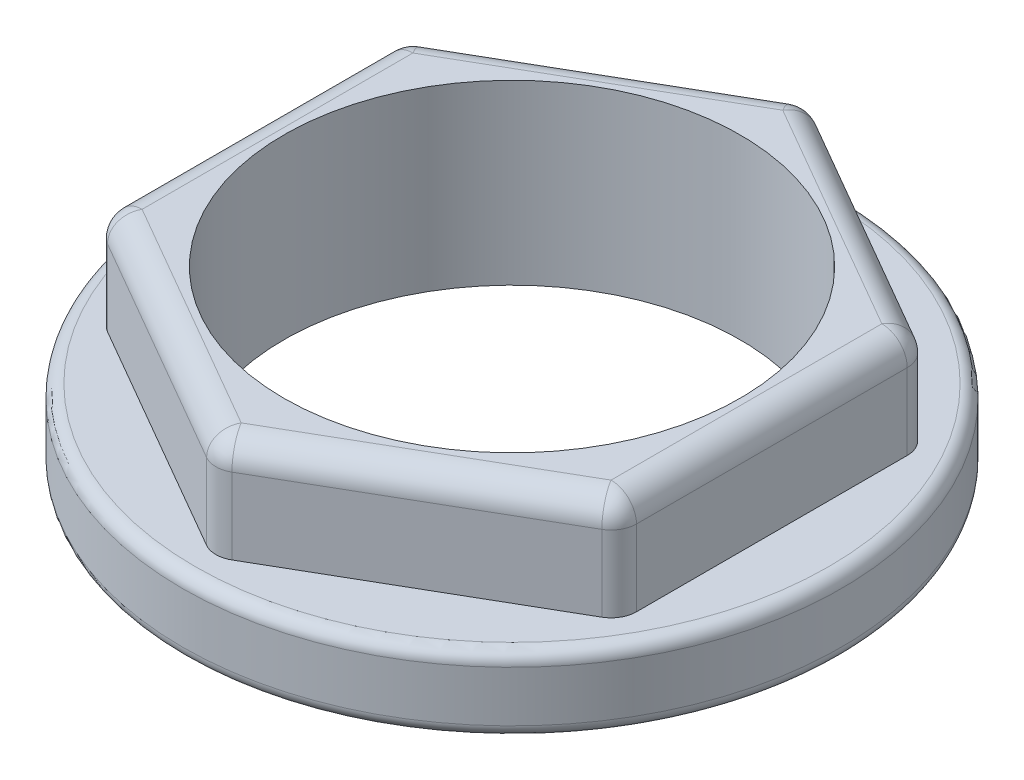
ISO-10303-21;
HEADER;
FILE_DESCRIPTION(('STEP AP214'),'2;1');
FILE_NAME('part.step','',(''),(''),'','','');
FILE_SCHEMA(('AUTOMOTIVE_DESIGN { 1 0 10303 214 1 1 1 1 }'));
ENDSEC;
DATA;
#1=APPLICATION_CONTEXT('core data for automotive mechanical design processes');
#2=APPLICATION_PROTOCOL_DEFINITION('international standard','automotive_design',2000,#1);
#3=PRODUCT_CONTEXT('',#1,'mechanical');
#4=PRODUCT('Part','Part','',(#3));
#5=PRODUCT_RELATED_PRODUCT_CATEGORY('part','',(#4));
#6=PRODUCT_DEFINITION_FORMATION('','',#4);
#7=PRODUCT_DEFINITION_CONTEXT('part definition',#1,'design');
#8=PRODUCT_DEFINITION('design','',#6,#7);
#9=PRODUCT_DEFINITION_SHAPE('','',#8);
#10=(LENGTH_UNIT() NAMED_UNIT(*) SI_UNIT(.MILLI.,.METRE.));
#11=(NAMED_UNIT(*) PLANE_ANGLE_UNIT() SI_UNIT($,.RADIAN.));
#12=(NAMED_UNIT(*) SI_UNIT($,.STERADIAN.) SOLID_ANGLE_UNIT());
#13=UNCERTAINTY_MEASURE_WITH_UNIT(LENGTH_MEASURE(1.E-05),#10,'distance_accuracy_value','');
#14=(GEOMETRIC_REPRESENTATION_CONTEXT(3) GLOBAL_UNCERTAINTY_ASSIGNED_CONTEXT((#13)) GLOBAL_UNIT_ASSIGNED_CONTEXT((#10,
#11,#12)) REPRESENTATION_CONTEXT('',''));
#15=CARTESIAN_POINT('',(0.,0.,0.));
#16=DIRECTION('',(0.,0.,1.));
#17=DIRECTION('',(1.,0.,0.));
#18=AXIS2_PLACEMENT_3D('',#15,#16,#17);
#19=CARTESIAN_POINT('',(0.,3.,0.));
#20=DIRECTION('',(0.,1.,0.));
#21=DIRECTION('',(0.,0.,1.));
#22=AXIS2_PLACEMENT_3D('',#19,#20,#21);
#23=PLANE('',#22);
#24=CARTESIAN_POINT('',(0.,3.,0.));
#25=DIRECTION('',(0.,1.,0.));
#26=DIRECTION('',(0.,0.,1.));
#27=AXIS2_PLACEMENT_3D('',#24,#25,#26);
#28=CIRCLE('',#27,12.5);
#29=CARTESIAN_POINT('',(0.,3.,12.5));
#30=VERTEX_POINT('',#29);
#31=EDGE_CURVE('E11',#30,#30,#28,.T.);
#32=ORIENTED_EDGE('',*,*,#31,.T.);
#33=EDGE_LOOP('',(#32));
#34=FACE_BOUND('',#33,.T.);
#35=DIRECTION('',(0.,0.,-1.));
#36=VECTOR('',#35,1.);
#37=CARTESIAN_POINT('',(10.25,3.,5.91784025919367));
#38=LINE('',#37,#36);
#39=CARTESIAN_POINT('',(10.25,3.,5.34048999000404));
#40=VERTEX_POINT('',#39);
#41=CARTESIAN_POINT('',(10.25,3.,-5.34048999000404));
#42=VERTEX_POINT('',#41);
#43=EDGE_CURVE('E164',#40,#42,#38,.T.);
#44=ORIENTED_EDGE('',*,*,#43,.F.);
#45=CARTESIAN_POINT('',(9.25,3.,5.34048999000404));
#46=DIRECTION('',(0.,1.,0.));
#47=DIRECTION('',(0.,0.,1.));
#48=AXIS2_PLACEMENT_3D('',#45,#46,#47);
#49=CIRCLE('',#48,1.);
#50=CARTESIAN_POINT('',(9.75,3.,6.20651539378848));
#51=VERTEX_POINT('',#50);
#52=EDGE_CURVE('E225',#40,#51,#49,.F.);
#53=ORIENTED_EDGE('',*,*,#52,.T.);
#54=DIRECTION('',(0.866025403784439,0.,-0.5));
#55=VECTOR('',#54,1.);
#56=CARTESIAN_POINT('',(0.,3.,11.8356805183873));
#57=LINE('',#56,#55);
#58=CARTESIAN_POINT('',(0.499999999999998,3.,11.5470053837925));
#59=VERTEX_POINT('',#58);
#60=EDGE_CURVE('E169',#59,#51,#57,.T.);
#61=ORIENTED_EDGE('',*,*,#60,.F.);
#62=CARTESIAN_POINT('',(0.,3.,10.6809799800081));
#63=DIRECTION('',(0.,1.,0.));
#64=DIRECTION('',(0.,0.,1.));
#65=AXIS2_PLACEMENT_3D('',#62,#63,#64);
#66=CIRCLE('',#65,1.);
#67=CARTESIAN_POINT('',(-0.500000000000002,3.,11.5470053837925));
#68=VERTEX_POINT('',#67);
#69=EDGE_CURVE('E227',#59,#68,#66,.F.);
#70=ORIENTED_EDGE('',*,*,#69,.T.);
#71=DIRECTION('',(0.866025403784439,0.,0.5));
#72=VECTOR('',#71,1.);
#73=CARTESIAN_POINT('',(-10.25,3.,5.91784025919366));
#74=LINE('',#73,#72);
#75=CARTESIAN_POINT('',(-9.75,3.,6.20651539378848));
#76=VERTEX_POINT('',#75);
#77=EDGE_CURVE('E175',#76,#68,#74,.T.);
#78=ORIENTED_EDGE('',*,*,#77,.F.);
#79=CARTESIAN_POINT('',(-9.25,3.,5.34048999000404));
#80=DIRECTION('',(0.,1.,0.));
#81=DIRECTION('',(0.,0.,1.));
#82=AXIS2_PLACEMENT_3D('',#79,#80,#81);
#83=CIRCLE('',#82,1.);
#84=CARTESIAN_POINT('',(-10.25,3.,5.34048999000404));
#85=VERTEX_POINT('',#84);
#86=EDGE_CURVE('E223',#76,#85,#83,.F.);
#87=ORIENTED_EDGE('',*,*,#86,.T.);
#88=DIRECTION('',(0.,0.,1.));
#89=VECTOR('',#88,1.);
#90=CARTESIAN_POINT('',(-10.25,3.,-5.91784025919367));
#91=LINE('',#90,#89);
#92=CARTESIAN_POINT('',(-10.25,3.,-5.34048999000404));
#93=VERTEX_POINT('',#92);
#94=EDGE_CURVE('E167',#93,#85,#91,.T.);
#95=ORIENTED_EDGE('',*,*,#94,.F.);
#96=CARTESIAN_POINT('',(-9.25,3.,-5.34048999000404));
#97=DIRECTION('',(0.,1.,0.));
#98=DIRECTION('',(0.,0.,1.));
#99=AXIS2_PLACEMENT_3D('',#96,#97,#98);
#100=CIRCLE('',#99,1.);
#101=CARTESIAN_POINT('',(-9.75,3.,-6.20651539378848));
#102=VERTEX_POINT('',#101);
#103=EDGE_CURVE('E221',#93,#102,#100,.F.);
#104=ORIENTED_EDGE('',*,*,#103,.T.);
#105=DIRECTION('',(-0.866025403784439,0.,0.5));
#106=VECTOR('',#105,1.);
#107=CARTESIAN_POINT('',(0.,3.,-11.8356805183873));
#108=LINE('',#107,#106);
#109=CARTESIAN_POINT('',(-0.500000000000002,3.,-11.5470053837925));
#110=VERTEX_POINT('',#109);
#111=EDGE_CURVE('E163',#110,#102,#108,.T.);
#112=ORIENTED_EDGE('',*,*,#111,.F.);
#113=CARTESIAN_POINT('',(0.,3.,-10.6809799800081));
#114=DIRECTION('',(0.,1.,0.));
#115=DIRECTION('',(0.,0.,1.));
#116=AXIS2_PLACEMENT_3D('',#113,#114,#115);
#117=CIRCLE('',#116,1.);
#118=CARTESIAN_POINT('',(0.499999999999999,3.,-11.5470053837925));
#119=VERTEX_POINT('',#118);
#120=EDGE_CURVE('E147',#110,#119,#117,.F.);
#121=ORIENTED_EDGE('',*,*,#120,.T.);
#122=DIRECTION('',(-0.866025403784439,0.,-0.5));
#123=VECTOR('',#122,1.);
#124=CARTESIAN_POINT('',(10.25,3.,-5.91784025919367));
#125=LINE('',#124,#123);
#126=CARTESIAN_POINT('',(9.75,3.,-6.20651539378848));
#127=VERTEX_POINT('',#126);
#128=EDGE_CURVE('E153',#127,#119,#125,.T.);
#129=ORIENTED_EDGE('',*,*,#128,.F.);
#130=CARTESIAN_POINT('',(9.25,3.,-5.34048999000404));
#131=DIRECTION('',(0.,1.,0.));
#132=DIRECTION('',(0.,0.,1.));
#133=AXIS2_PLACEMENT_3D('',#130,#131,#132);
#134=CIRCLE('',#133,1.);
#135=EDGE_CURVE('E137',#127,#42,#134,.F.);
#136=ORIENTED_EDGE('',*,*,#135,.T.);
#137=EDGE_LOOP('',(#44,#53,#61,#70,#78,#87,#95,#104,#112,#121,#129,#136));
#138=FACE_BOUND('',#137,.T.);
#139=ADVANCED_FACE('F31',(#34,#138),#23,.T.);
#140=CARTESIAN_POINT('',(0.,0.,0.));
#141=DIRECTION('',(0.,1.,0.));
#142=DIRECTION('',(0.,0.,1.));
#143=AXIS2_PLACEMENT_3D('',#140,#141,#142);
#144=PLANE('',#143);
#145=CARTESIAN_POINT('',(0.,0.,0.));
#146=DIRECTION('',(0.,1.,0.));
#147=DIRECTION('',(0.,0.,1.));
#148=AXIS2_PLACEMENT_3D('',#145,#146,#147);
#149=CIRCLE('',#148,12.5);
#150=CARTESIAN_POINT('',(0.,0.,12.5));
#151=VERTEX_POINT('',#150);
#152=EDGE_CURVE('E39',#151,#151,#149,.F.);
#153=ORIENTED_EDGE('',*,*,#152,.T.);
#154=EDGE_LOOP('',(#153));
#155=FACE_BOUND('',#154,.T.);
#156=CARTESIAN_POINT('',(0.,0.,0.));
#157=DIRECTION('',(0.,1.,0.));
#158=DIRECTION('',(0.,0.,1.));
#159=AXIS2_PLACEMENT_3D('',#156,#157,#158);
#160=CIRCLE('',#159,9.);
#161=CARTESIAN_POINT('',(0.,0.,9.));
#162=VERTEX_POINT('',#161);
#163=EDGE_CURVE('E177',#162,#162,#160,.T.);
#164=ORIENTED_EDGE('',*,*,#163,.T.);
#165=EDGE_LOOP('',(#164));
#166=FACE_BOUND('',#165,.T.);
#167=ADVANCED_FACE('F290',(#155,#166),#144,.F.);
#168=CARTESIAN_POINT('',(0.,3.,0.));
#169=DIRECTION('',(0.,-1.,0.));
#170=DIRECTION('',(0.,0.,-1.));
#171=AXIS2_PLACEMENT_3D('',#168,#169,#170);
#172=CYLINDRICAL_SURFACE('',#171,13.);
#173=CARTESIAN_POINT('',(0.,0.5,0.));
#174=DIRECTION('',(0.,1.,0.));
#175=DIRECTION('',(0.,0.,1.));
#176=AXIS2_PLACEMENT_3D('',#173,#174,#175);
#177=CIRCLE('',#176,13.);
#178=CARTESIAN_POINT('',(0.,0.5,13.));
#179=VERTEX_POINT('',#178);
#180=EDGE_CURVE('E285',#179,#179,#177,.T.);
#181=ORIENTED_EDGE('',*,*,#180,.T.);
#182=EDGE_LOOP('',(#181));
#183=FACE_BOUND('',#182,.T.);
#184=CARTESIAN_POINT('',(0.,2.5,0.));
#185=DIRECTION('',(0.,1.,0.));
#186=DIRECTION('',(0.,0.,1.));
#187=AXIS2_PLACEMENT_3D('',#184,#185,#186);
#188=CIRCLE('',#187,13.);
#189=CARTESIAN_POINT('',(0.,2.5,13.));
#190=VERTEX_POINT('',#189);
#191=EDGE_CURVE('E229',#190,#190,#188,.F.);
#192=ORIENTED_EDGE('',*,*,#191,.T.);
#193=EDGE_LOOP('',(#192));
#194=FACE_BOUND('',#193,.T.);
#195=ADVANCED_FACE('F298',(#183,#194),#172,.T.);
#196=CARTESIAN_POINT('',(0.,3.,0.));
#197=DIRECTION('',(0.,-1.,0.));
#198=DIRECTION('',(0.,0.,-1.));
#199=AXIS2_PLACEMENT_3D('',#196,#197,#198);
#200=CYLINDRICAL_SURFACE('',#199,9.);
#201=ORIENTED_EDGE('',*,*,#163,.F.);
#202=EDGE_LOOP('',(#201));
#203=FACE_BOUND('',#202,.T.);
#204=CARTESIAN_POINT('',(0.,7.,0.));
#205=DIRECTION('',(0.,1.,0.));
#206=DIRECTION('',(0.,0.,1.));
#207=AXIS2_PLACEMENT_3D('',#204,#205,#206);
#208=CIRCLE('',#207,9.);
#209=CARTESIAN_POINT('',(0.,7.,9.));
#210=VERTEX_POINT('',#209);
#211=EDGE_CURVE('E282',#210,#210,#208,.T.);
#212=ORIENTED_EDGE('',*,*,#211,.T.);
#213=EDGE_LOOP('',(#212));
#214=FACE_BOUND('',#213,.T.);
#215=ADVANCED_FACE('F301',(#203,#214),#200,.F.);
#216=CARTESIAN_POINT('',(10.25,7.,5.91784025919367));
#217=DIRECTION('',(0.,1.,0.));
#218=DIRECTION('',(0.,0.,1.));
#219=AXIS2_PLACEMENT_3D('',#216,#217,#218);
#220=PLANE('',#219);
#221=DIRECTION('',(0.,0.,-1.));
#222=VECTOR('',#221,1.);
#223=CARTESIAN_POINT('',(9.25,7.,-5.91784025919367));
#224=LINE('',#223,#222);
#225=CARTESIAN_POINT('',(9.25,7.,5.34048999000404));
#226=VERTEX_POINT('',#225);
#227=CARTESIAN_POINT('',(9.25,7.,-5.34048999000405));
#228=VERTEX_POINT('',#227);
#229=EDGE_CURVE('E196',#226,#228,#224,.T.);
#230=ORIENTED_EDGE('',*,*,#229,.T.);
#231=DIRECTION('',(-0.866025403784439,0.,-0.5));
#232=VECTOR('',#231,1.);
#233=CARTESIAN_POINT('',(-0.5,7.,-10.9696551146029));
#234=LINE('',#233,#232);
#235=CARTESIAN_POINT('',(0.,7.,-10.6809799800081));
#236=VERTEX_POINT('',#235);
#237=EDGE_CURVE('E202',#228,#236,#234,.T.);
#238=ORIENTED_EDGE('',*,*,#237,.T.);
#239=DIRECTION('',(-0.866025403784439,0.,0.5));
#240=VECTOR('',#239,1.);
#241=CARTESIAN_POINT('',(-9.75000000000001,7.,-5.05181485540923));
#242=LINE('',#241,#240);
#243=CARTESIAN_POINT('',(-9.25,7.,-5.34048999000405));
#244=VERTEX_POINT('',#243);
#245=EDGE_CURVE('E200',#236,#244,#242,.T.);
#246=ORIENTED_EDGE('',*,*,#245,.T.);
#247=DIRECTION('',(0.,0.,1.));
#248=VECTOR('',#247,1.);
#249=CARTESIAN_POINT('',(-9.25,7.,5.91784025919366));
#250=LINE('',#249,#248);
#251=CARTESIAN_POINT('',(-9.25,7.,5.34048999000404));
#252=VERTEX_POINT('',#251);
#253=EDGE_CURVE('E198',#244,#252,#250,.T.);
#254=ORIENTED_EDGE('',*,*,#253,.T.);
#255=DIRECTION('',(0.866025403784439,0.,0.5));
#256=VECTOR('',#255,1.);
#257=CARTESIAN_POINT('',(0.499999999999998,7.,10.9696551146029));
#258=LINE('',#257,#256);
#259=CARTESIAN_POINT('',(0.,7.,10.6809799800081));
#260=VERTEX_POINT('',#259);
#261=EDGE_CURVE('E192',#252,#260,#258,.T.);
#262=ORIENTED_EDGE('',*,*,#261,.T.);
#263=DIRECTION('',(0.866025403784439,0.,-0.5));
#264=VECTOR('',#263,1.);
#265=CARTESIAN_POINT('',(9.75,7.,5.05181485540923));
#266=LINE('',#265,#264);
#267=EDGE_CURVE('E194',#260,#226,#266,.T.);
#268=ORIENTED_EDGE('',*,*,#267,.T.);
#269=EDGE_LOOP('',(#230,#238,#246,#254,#262,#268));
#270=FACE_BOUND('',#269,.T.);
#271=ORIENTED_EDGE('',*,*,#211,.F.);
#272=EDGE_LOOP('',(#271));
#273=FACE_BOUND('',#272,.T.);
#274=ADVANCED_FACE('F442',(#270,#273),#220,.T.);
#275=CARTESIAN_POINT('',(0.,7.,11.8356805183873));
#276=DIRECTION('',(-0.5,0.,-0.866025403784439));
#277=DIRECTION('',(-0.866025403784439,0.,0.5));
#278=AXIS2_PLACEMENT_3D('',#275,#276,#277);
#279=PLANE('',#278);
#280=ORIENTED_EDGE('',*,*,#60,.T.);
#281=DIRECTION('',(0.,-1.,0.));
#282=VECTOR('',#281,1.);
#283=CARTESIAN_POINT('',(9.75,7.,6.20651539378848));
#284=LINE('',#283,#282);
#285=CARTESIAN_POINT('',(9.75,6.,6.20651539378848));
#286=VERTEX_POINT('',#285);
#287=EDGE_CURVE('E215',#51,#286,#284,.F.);
#288=ORIENTED_EDGE('',*,*,#287,.T.);
#289=DIRECTION('',(0.866025403784439,0.,-0.5));
#290=VECTOR('',#289,1.);
#291=CARTESIAN_POINT('',(0.,6.,11.8356805183873));
#292=LINE('',#291,#290);
#293=CARTESIAN_POINT('',(0.499999999999998,6.,11.5470053837925));
#294=VERTEX_POINT('',#293);
#295=EDGE_CURVE('E213',#286,#294,#292,.F.);
#296=ORIENTED_EDGE('',*,*,#295,.T.);
#297=DIRECTION('',(0.,-1.,0.));
#298=VECTOR('',#297,1.);
#299=CARTESIAN_POINT('',(0.499999999999998,7.,11.5470053837925));
#300=LINE('',#299,#298);
#301=EDGE_CURVE('E211',#294,#59,#300,.T.);
#302=ORIENTED_EDGE('',*,*,#301,.T.);
#303=EDGE_LOOP('',(#280,#288,#296,#302));
#304=FACE_BOUND('',#303,.T.);
#305=ADVANCED_FACE('F436',(#304),#279,.F.);
#306=CARTESIAN_POINT('',(10.25,7.,5.91784025919367));
#307=DIRECTION('',(-1.,0.,0.));
#308=DIRECTION('',(0.,0.,1.));
#309=AXIS2_PLACEMENT_3D('',#306,#307,#308);
#310=PLANE('',#309);
#311=ORIENTED_EDGE('',*,*,#43,.T.);
#312=DIRECTION('',(0.,-1.,0.));
#313=VECTOR('',#312,1.);
#314=CARTESIAN_POINT('',(10.25,7.,-5.34048999000404));
#315=LINE('',#314,#313);
#316=CARTESIAN_POINT('',(10.25,6.,-5.34048999000404));
#317=VERTEX_POINT('',#316);
#318=EDGE_CURVE('E142',#42,#317,#315,.F.);
#319=ORIENTED_EDGE('',*,*,#318,.T.);
#320=DIRECTION('',(0.,0.,-1.));
#321=VECTOR('',#320,1.);
#322=CARTESIAN_POINT('',(10.25,6.,5.91784025919367));
#323=LINE('',#322,#321);
#324=CARTESIAN_POINT('',(10.25,6.,5.34048999000404));
#325=VERTEX_POINT('',#324);
#326=EDGE_CURVE('E183',#317,#325,#323,.F.);
#327=ORIENTED_EDGE('',*,*,#326,.T.);
#328=DIRECTION('',(0.,-1.,0.));
#329=VECTOR('',#328,1.);
#330=CARTESIAN_POINT('',(10.25,7.,5.34048999000404));
#331=LINE('',#330,#329);
#332=EDGE_CURVE('E158',#325,#40,#331,.T.);
#333=ORIENTED_EDGE('',*,*,#332,.T.);
#334=EDGE_LOOP('',(#311,#319,#327,#333));
#335=FACE_BOUND('',#334,.T.);
#336=ADVANCED_FACE('F425',(#335),#310,.F.);
#337=CARTESIAN_POINT('',(10.25,7.,-5.91784025919367));
#338=DIRECTION('',(-0.5,0.,0.866025403784439));
#339=DIRECTION('',(0.866025403784439,0.,0.5));
#340=AXIS2_PLACEMENT_3D('',#337,#338,#339);
#341=PLANE('',#340);
#342=DIRECTION('',(-0.866025403784439,0.,-0.5));
#343=VECTOR('',#342,1.);
#344=CARTESIAN_POINT('',(10.25,6.,-5.91784025919367));
#345=LINE('',#344,#343);
#346=CARTESIAN_POINT('',(0.499999999999999,6.,-11.5470053837925));
#347=VERTEX_POINT('',#346);
#348=CARTESIAN_POINT('',(9.75,6.,-6.20651539378848));
#349=VERTEX_POINT('',#348);
#350=EDGE_CURVE('E156',#347,#349,#345,.F.);
#351=ORIENTED_EDGE('',*,*,#350,.T.);
#352=DIRECTION('',(0.,-1.,0.));
#353=VECTOR('',#352,1.);
#354=CARTESIAN_POINT('',(9.75,7.,-6.20651539378848));
#355=LINE('',#354,#353);
#356=EDGE_CURVE('E141',#349,#127,#355,.T.);
#357=ORIENTED_EDGE('',*,*,#356,.T.);
#358=ORIENTED_EDGE('',*,*,#128,.T.);
#359=DIRECTION('',(0.,-1.,0.));
#360=VECTOR('',#359,1.);
#361=CARTESIAN_POINT('',(0.499999999999999,7.,-11.5470053837925));
#362=LINE('',#361,#360);
#363=EDGE_CURVE('E159',#119,#347,#362,.F.);
#364=ORIENTED_EDGE('',*,*,#363,.T.);
#365=EDGE_LOOP('',(#351,#357,#358,#364));
#366=FACE_BOUND('',#365,.T.);
#367=ADVANCED_FACE('F152',(#366),#341,.F.);
#368=CARTESIAN_POINT('',(0.,7.,-11.8356805183873));
#369=DIRECTION('',(0.5,0.,0.866025403784439));
#370=DIRECTION('',(0.866025403784439,0.,-0.5));
#371=AXIS2_PLACEMENT_3D('',#368,#369,#370);
#372=PLANE('',#371);
#373=DIRECTION('',(-0.866025403784439,0.,0.5));
#374=VECTOR('',#373,1.);
#375=CARTESIAN_POINT('',(0.,6.,-11.8356805183873));
#376=LINE('',#375,#374);
#377=CARTESIAN_POINT('',(-9.75,6.,-6.20651539378848));
#378=VERTEX_POINT('',#377);
#379=CARTESIAN_POINT('',(-0.500000000000002,6.,-11.5470053837925));
#380=VERTEX_POINT('',#379);
#381=EDGE_CURVE('E188',#378,#380,#376,.F.);
#382=ORIENTED_EDGE('',*,*,#381,.T.);
#383=DIRECTION('',(0.,-1.,0.));
#384=VECTOR('',#383,1.);
#385=CARTESIAN_POINT('',(-0.500000000000002,7.,-11.5470053837925));
#386=LINE('',#385,#384);
#387=EDGE_CURVE('E190',#380,#110,#386,.T.);
#388=ORIENTED_EDGE('',*,*,#387,.T.);
#389=ORIENTED_EDGE('',*,*,#111,.T.);
#390=DIRECTION('',(0.,-1.,0.));
#391=VECTOR('',#390,1.);
#392=CARTESIAN_POINT('',(-9.75,7.,-6.20651539378848));
#393=LINE('',#392,#391);
#394=EDGE_CURVE('E186',#102,#378,#393,.F.);
#395=ORIENTED_EDGE('',*,*,#394,.T.);
#396=EDGE_LOOP('',(#382,#388,#389,#395));
#397=FACE_BOUND('',#396,.T.);
#398=ADVANCED_FACE('F410',(#397),#372,.F.);
#399=CARTESIAN_POINT('',(-10.25,7.,-5.91784025919367));
#400=DIRECTION('',(1.,0.,0.));
#401=DIRECTION('',(0.,0.,-1.));
#402=AXIS2_PLACEMENT_3D('',#399,#400,#401);
#403=PLANE('',#402);
#404=DIRECTION('',(0.,0.,1.));
#405=VECTOR('',#404,1.);
#406=CARTESIAN_POINT('',(-10.25,6.,-5.91784025919367));
#407=LINE('',#406,#405);
#408=CARTESIAN_POINT('',(-10.25,6.,5.34048999000404));
#409=VERTEX_POINT('',#408);
#410=CARTESIAN_POINT('',(-10.25,6.,-5.34048999000404));
#411=VERTEX_POINT('',#410);
#412=EDGE_CURVE('E207',#409,#411,#407,.F.);
#413=ORIENTED_EDGE('',*,*,#412,.T.);
#414=DIRECTION('',(0.,-1.,0.));
#415=VECTOR('',#414,1.);
#416=CARTESIAN_POINT('',(-10.25,7.,-5.34048999000404));
#417=LINE('',#416,#415);
#418=EDGE_CURVE('E209',#411,#93,#417,.T.);
#419=ORIENTED_EDGE('',*,*,#418,.T.);
#420=ORIENTED_EDGE('',*,*,#94,.T.);
#421=DIRECTION('',(0.,-1.,0.));
#422=VECTOR('',#421,1.);
#423=CARTESIAN_POINT('',(-10.25,7.,5.34048999000404));
#424=LINE('',#423,#422);
#425=EDGE_CURVE('E205',#85,#409,#424,.F.);
#426=ORIENTED_EDGE('',*,*,#425,.T.);
#427=EDGE_LOOP('',(#413,#419,#420,#426));
#428=FACE_BOUND('',#427,.T.);
#429=ADVANCED_FACE('F391',(#428),#403,.F.);
#430=CARTESIAN_POINT('',(-10.25,7.,5.91784025919366));
#431=DIRECTION('',(0.5,0.,-0.866025403784439));
#432=DIRECTION('',(-0.866025403784439,0.,-0.5));
#433=AXIS2_PLACEMENT_3D('',#430,#431,#432);
#434=PLANE('',#433);
#435=DIRECTION('',(0.866025403784439,0.,0.5));
#436=VECTOR('',#435,1.);
#437=CARTESIAN_POINT('',(-10.25,6.,5.91784025919366));
#438=LINE('',#437,#436);
#439=CARTESIAN_POINT('',(-0.500000000000003,6.,11.5470053837925));
#440=VERTEX_POINT('',#439);
#441=CARTESIAN_POINT('',(-9.75,6.,6.20651539378848));
#442=VERTEX_POINT('',#441);
#443=EDGE_CURVE('E46',#440,#442,#438,.F.);
#444=ORIENTED_EDGE('',*,*,#443,.T.);
#445=DIRECTION('',(0.,-1.,0.));
#446=VECTOR('',#445,1.);
#447=CARTESIAN_POINT('',(-9.75,7.,6.20651539378848));
#448=LINE('',#447,#446);
#449=EDGE_CURVE('E148',#442,#76,#448,.T.);
#450=ORIENTED_EDGE('',*,*,#449,.T.);
#451=ORIENTED_EDGE('',*,*,#77,.T.);
#452=DIRECTION('',(0.,-1.,0.));
#453=VECTOR('',#452,1.);
#454=CARTESIAN_POINT('',(-0.500000000000002,7.,11.5470053837925));
#455=LINE('',#454,#453);
#456=EDGE_CURVE('E51',#68,#440,#455,.F.);
#457=ORIENTED_EDGE('',*,*,#456,.T.);
#458=EDGE_LOOP('',(#444,#450,#451,#457));
#459=FACE_BOUND('',#458,.T.);
#460=ADVANCED_FACE('F386',(#459),#434,.F.);
#461=CARTESIAN_POINT('',(-9.25,7.,5.34048999000404));
#462=DIRECTION('',(0.,-1.,0.));
#463=DIRECTION('',(0.,0.,-1.));
#464=AXIS2_PLACEMENT_3D('',#461,#462,#463);
#465=CYLINDRICAL_SURFACE('',#464,1.);
#466=CARTESIAN_POINT('',(-9.25,6.,5.34048999000404));
#467=DIRECTION('',(0.,1.,0.));
#468=DIRECTION('',(0.,0.,1.));
#469=AXIS2_PLACEMENT_3D('',#466,#467,#468);
#470=CIRCLE('',#469,1.);
#471=EDGE_CURVE('E279',#409,#442,#470,.T.);
#472=ORIENTED_EDGE('',*,*,#471,.F.);
#473=ORIENTED_EDGE('',*,*,#425,.F.);
#474=ORIENTED_EDGE('',*,*,#86,.F.);
#475=ORIENTED_EDGE('',*,*,#449,.F.);
#476=EDGE_LOOP('',(#472,#473,#474,#475));
#477=FACE_BOUND('',#476,.T.);
#478=ADVANCED_FACE('F383',(#477),#465,.T.);
#479=CARTESIAN_POINT('',(-9.25,6.,5.34048999000404));
#480=DIRECTION('',(0.,0.,1.));
#481=DIRECTION('',(1.,0.,0.));
#482=AXIS2_PLACEMENT_3D('',#479,#480,#481);
#483=SPHERICAL_SURFACE('',#482,1.);
#484=CARTESIAN_POINT('',(-9.25,6.,5.34048999000404));
#485=DIRECTION('',(0.,0.,1.));
#486=DIRECTION('',(1.,0.,0.));
#487=AXIS2_PLACEMENT_3D('',#484,#485,#486);
#488=CIRCLE('',#487,1.);
#489=EDGE_CURVE('E273',#409,#252,#488,.F.);
#490=ORIENTED_EDGE('',*,*,#489,.F.);
#491=ORIENTED_EDGE('',*,*,#471,.T.);
#492=CARTESIAN_POINT('',(-9.25,6.,5.34048999000404));
#493=DIRECTION('',(-0.866025403784438,0.,-0.5));
#494=DIRECTION('',(-0.5,0.,0.866025403784438));
#495=AXIS2_PLACEMENT_3D('',#492,#493,#494);
#496=CIRCLE('',#495,1.);
#497=EDGE_CURVE('E276',#252,#442,#496,.F.);
#498=ORIENTED_EDGE('',*,*,#497,.F.);
#499=EDGE_LOOP('',(#490,#491,#498));
#500=FACE_BOUND('',#499,.T.);
#501=ADVANCED_FACE('F379',(#500),#483,.T.);
#502=CARTESIAN_POINT('',(0.,7.,10.6809799800081));
#503=DIRECTION('',(0.,-1.,0.));
#504=DIRECTION('',(0.,0.,-1.));
#505=AXIS2_PLACEMENT_3D('',#502,#503,#504);
#506=CYLINDRICAL_SURFACE('',#505,1.);
#507=ORIENTED_EDGE('',*,*,#69,.F.);
#508=ORIENTED_EDGE('',*,*,#301,.F.);
#509=CARTESIAN_POINT('',(0.,6.,10.6809799800081));
#510=DIRECTION('',(0.,1.,0.));
#511=DIRECTION('',(0.,0.,1.));
#512=AXIS2_PLACEMENT_3D('',#509,#510,#511);
#513=CIRCLE('',#512,1.);
#514=EDGE_CURVE('E270',#440,#294,#513,.T.);
#515=ORIENTED_EDGE('',*,*,#514,.F.);
#516=ORIENTED_EDGE('',*,*,#456,.F.);
#517=EDGE_LOOP('',(#507,#508,#515,#516));
#518=FACE_BOUND('',#517,.T.);
#519=ADVANCED_FACE('F375',(#518),#506,.T.);
#520=CARTESIAN_POINT('',(5.625,6.,13.9285752441997));
#521=DIRECTION('',(-0.866025403784439,0.,-0.5));
#522=DIRECTION('',(-0.5,0.,0.866025403784439));
#523=AXIS2_PLACEMENT_3D('',#520,#521,#522);
#524=CYLINDRICAL_SURFACE('',#523,1.);
#525=ORIENTED_EDGE('',*,*,#497,.T.);
#526=ORIENTED_EDGE('',*,*,#443,.F.);
#527=CARTESIAN_POINT('',(0.,6.,10.6809799800081));
#528=DIRECTION('',(0.866025403784438,0.,0.500000000000001));
#529=DIRECTION('',(0.500000000000001,0.,-0.866025403784438));
#530=AXIS2_PLACEMENT_3D('',#527,#528,#529);
#531=CIRCLE('',#530,1.);
#532=EDGE_CURVE('E267',#260,#440,#531,.T.);
#533=ORIENTED_EDGE('',*,*,#532,.F.);
#534=ORIENTED_EDGE('',*,*,#261,.F.);
#535=EDGE_LOOP('',(#525,#526,#533,#534));
#536=FACE_BOUND('',#535,.T.);
#537=ADVANCED_FACE('F371',(#536),#524,.T.);
#538=CARTESIAN_POINT('',(-9.25,6.,5.91784025919367));
#539=DIRECTION('',(0.,0.,-1.));
#540=DIRECTION('',(-1.,0.,0.));
#541=AXIS2_PLACEMENT_3D('',#538,#539,#540);
#542=CYLINDRICAL_SURFACE('',#541,1.);
#543=ORIENTED_EDGE('',*,*,#489,.T.);
#544=ORIENTED_EDGE('',*,*,#253,.F.);
#545=CARTESIAN_POINT('',(-9.25,6.,-5.34048999000404));
#546=DIRECTION('',(0.,0.,-1.));
#547=DIRECTION('',(0.,1.,0.));
#548=AXIS2_PLACEMENT_3D('',#545,#546,#547);
#549=CIRCLE('',#548,1.);
#550=EDGE_CURVE('E264',#411,#244,#549,.T.);
#551=ORIENTED_EDGE('',*,*,#550,.F.);
#552=ORIENTED_EDGE('',*,*,#412,.F.);
#553=EDGE_LOOP('',(#543,#544,#551,#552));
#554=FACE_BOUND('',#553,.T.);
#555=ADVANCED_FACE('F367',(#554),#542,.T.);
#556=CARTESIAN_POINT('',(-9.25,7.,-5.34048999000404));
#557=DIRECTION('',(0.,-1.,0.));
#558=DIRECTION('',(0.,0.,-1.));
#559=AXIS2_PLACEMENT_3D('',#556,#557,#558);
#560=CYLINDRICAL_SURFACE('',#559,1.);
#561=ORIENTED_EDGE('',*,*,#103,.F.);
#562=ORIENTED_EDGE('',*,*,#418,.F.);
#563=CARTESIAN_POINT('',(-9.25,6.,-5.34048999000404));
#564=DIRECTION('',(0.,1.,0.));
#565=DIRECTION('',(0.,0.,1.));
#566=AXIS2_PLACEMENT_3D('',#563,#564,#565);
#567=CIRCLE('',#566,1.);
#568=EDGE_CURVE('E261',#378,#411,#567,.T.);
#569=ORIENTED_EDGE('',*,*,#568,.F.);
#570=ORIENTED_EDGE('',*,*,#394,.F.);
#571=EDGE_LOOP('',(#561,#562,#569,#570));
#572=FACE_BOUND('',#571,.T.);
#573=ADVANCED_FACE('F363',(#572),#560,.T.);
#574=CARTESIAN_POINT('',(0.,6.,10.6809799800081));
#575=DIRECTION('',(0.,0.,1.));
#576=DIRECTION('',(1.,0.,0.));
#577=AXIS2_PLACEMENT_3D('',#574,#575,#576);
#578=SPHERICAL_SURFACE('',#577,1.);
#579=ORIENTED_EDGE('',*,*,#532,.T.);
#580=ORIENTED_EDGE('',*,*,#514,.T.);
#581=CARTESIAN_POINT('',(0.,6.,10.6809799800081));
#582=DIRECTION('',(-0.866025403784439,0.,0.5));
#583=DIRECTION('',(0.5,0.,0.866025403784439));
#584=AXIS2_PLACEMENT_3D('',#581,#582,#583);
#585=CIRCLE('',#584,1.);
#586=EDGE_CURVE('E258',#260,#294,#585,.F.);
#587=ORIENTED_EDGE('',*,*,#586,.F.);
#588=EDGE_LOOP('',(#579,#580,#587));
#589=FACE_BOUND('',#588,.T.);
#590=ADVANCED_FACE('F359',(#589),#578,.T.);
#591=CARTESIAN_POINT('',(-9.25,6.,-5.34048999000404));
#592=DIRECTION('',(0.,0.,1.));
#593=DIRECTION('',(1.,0.,0.));
#594=AXIS2_PLACEMENT_3D('',#591,#592,#593);
#595=SPHERICAL_SURFACE('',#594,1.);
#596=ORIENTED_EDGE('',*,*,#568,.T.);
#597=ORIENTED_EDGE('',*,*,#550,.T.);
#598=CARTESIAN_POINT('',(-9.25,6.,-5.34048999000405));
#599=DIRECTION('',(-0.866025403784437,0.,0.500000000000003));
#600=DIRECTION('',(0.500000000000003,0.,0.866025403784437));
#601=AXIS2_PLACEMENT_3D('',#598,#599,#600);
#602=CIRCLE('',#601,1.);
#603=EDGE_CURVE('E255',#378,#244,#602,.F.);
#604=ORIENTED_EDGE('',*,*,#603,.F.);
#605=EDGE_LOOP('',(#596,#597,#604));
#606=FACE_BOUND('',#605,.T.);
#607=ADVANCED_FACE('F355',(#606),#595,.T.);
#608=CARTESIAN_POINT('',(9.25,7.,5.34048999000404));
#609=DIRECTION('',(0.,-1.,0.));
#610=DIRECTION('',(0.,0.,-1.));
#611=AXIS2_PLACEMENT_3D('',#608,#609,#610);
#612=CYLINDRICAL_SURFACE('',#611,1.);
#613=ORIENTED_EDGE('',*,*,#52,.F.);
#614=ORIENTED_EDGE('',*,*,#332,.F.);
#615=CARTESIAN_POINT('',(9.25,6.,5.34048999000404));
#616=DIRECTION('',(0.,1.,0.));
#617=DIRECTION('',(0.,0.,1.));
#618=AXIS2_PLACEMENT_3D('',#615,#616,#617);
#619=CIRCLE('',#618,1.);
#620=EDGE_CURVE('E252',#286,#325,#619,.T.);
#621=ORIENTED_EDGE('',*,*,#620,.F.);
#622=ORIENTED_EDGE('',*,*,#287,.F.);
#623=EDGE_LOOP('',(#613,#614,#621,#622));
#624=FACE_BOUND('',#623,.T.);
#625=ADVANCED_FACE('F351',(#624),#612,.T.);
#626=CARTESIAN_POINT('',(9.75,6.,5.05181485540923));
#627=DIRECTION('',(-0.866025403784439,0.,0.5));
#628=DIRECTION('',(0.5,0.,0.866025403784439));
#629=AXIS2_PLACEMENT_3D('',#626,#627,#628);
#630=CYLINDRICAL_SURFACE('',#629,1.);
#631=ORIENTED_EDGE('',*,*,#586,.T.);
#632=ORIENTED_EDGE('',*,*,#295,.F.);
#633=CARTESIAN_POINT('',(9.25,6.,5.34048999000404));
#634=DIRECTION('',(0.866025403784438,0.,-0.5));
#635=DIRECTION('',(-0.5,0.,-0.866025403784438));
#636=AXIS2_PLACEMENT_3D('',#633,#634,#635);
#637=CIRCLE('',#636,1.);
#638=EDGE_CURVE('E249',#226,#286,#637,.T.);
#639=ORIENTED_EDGE('',*,*,#638,.F.);
#640=ORIENTED_EDGE('',*,*,#267,.F.);
#641=EDGE_LOOP('',(#631,#632,#639,#640));
#642=FACE_BOUND('',#641,.T.);
#643=ADVANCED_FACE('F347',(#642),#630,.T.);
#644=CARTESIAN_POINT('',(0.499999999999992,6.,-10.9696551146029));
#645=DIRECTION('',(0.866025403784439,0.,-0.5));
#646=DIRECTION('',(-0.5,0.,-0.866025403784439));
#647=AXIS2_PLACEMENT_3D('',#644,#645,#646);
#648=CYLINDRICAL_SURFACE('',#647,1.);
#649=ORIENTED_EDGE('',*,*,#603,.T.);
#650=ORIENTED_EDGE('',*,*,#245,.F.);
#651=CARTESIAN_POINT('',(0.,6.,-10.6809799800081));
#652=DIRECTION('',(0.866025403784439,0.,-0.5));
#653=DIRECTION('',(-0.5,0.,-0.866025403784439));
#654=AXIS2_PLACEMENT_3D('',#651,#652,#653);
#655=CIRCLE('',#654,1.);
#656=EDGE_CURVE('E246',#380,#236,#655,.T.);
#657=ORIENTED_EDGE('',*,*,#656,.F.);
#658=ORIENTED_EDGE('',*,*,#381,.F.);
#659=EDGE_LOOP('',(#649,#650,#657,#658));
#660=FACE_BOUND('',#659,.T.);
#661=ADVANCED_FACE('F343',(#660),#648,.T.);
#662=CARTESIAN_POINT('',(0.,7.,-10.6809799800081));
#663=DIRECTION('',(0.,-1.,0.));
#664=DIRECTION('',(0.,0.,-1.));
#665=AXIS2_PLACEMENT_3D('',#662,#663,#664);
#666=CYLINDRICAL_SURFACE('',#665,1.);
#667=ORIENTED_EDGE('',*,*,#120,.F.);
#668=ORIENTED_EDGE('',*,*,#387,.F.);
#669=CARTESIAN_POINT('',(0.,6.,-10.6809799800081));
#670=DIRECTION('',(0.,1.,0.));
#671=DIRECTION('',(0.,0.,1.));
#672=AXIS2_PLACEMENT_3D('',#669,#670,#671);
#673=CIRCLE('',#672,1.);
#674=EDGE_CURVE('E243',#347,#380,#673,.T.);
#675=ORIENTED_EDGE('',*,*,#674,.F.);
#676=ORIENTED_EDGE('',*,*,#363,.F.);
#677=EDGE_LOOP('',(#667,#668,#675,#676));
#678=FACE_BOUND('',#677,.T.);
#679=ADVANCED_FACE('F339',(#678),#666,.T.);
#680=CARTESIAN_POINT('',(9.25,6.,5.34048999000404));
#681=DIRECTION('',(0.,0.,1.));
#682=DIRECTION('',(1.,0.,0.));
#683=AXIS2_PLACEMENT_3D('',#680,#681,#682);
#684=SPHERICAL_SURFACE('',#683,1.);
#685=ORIENTED_EDGE('',*,*,#638,.T.);
#686=ORIENTED_EDGE('',*,*,#620,.T.);
#687=CARTESIAN_POINT('',(9.25,6.,5.34048999000404));
#688=DIRECTION('',(0.,0.,1.));
#689=DIRECTION('',(0.,-1.,0.));
#690=AXIS2_PLACEMENT_3D('',#687,#688,#689);
#691=CIRCLE('',#690,1.);
#692=EDGE_CURVE('E240',#226,#325,#691,.F.);
#693=ORIENTED_EDGE('',*,*,#692,.F.);
#694=EDGE_LOOP('',(#685,#686,#693));
#695=FACE_BOUND('',#694,.T.);
#696=ADVANCED_FACE('F335',(#695),#684,.T.);
#697=CARTESIAN_POINT('',(0.,6.,-10.6809799800081));
#698=DIRECTION('',(0.,0.,1.));
#699=DIRECTION('',(1.,0.,0.));
#700=AXIS2_PLACEMENT_3D('',#697,#698,#699);
#701=SPHERICAL_SURFACE('',#700,1.);
#702=ORIENTED_EDGE('',*,*,#674,.T.);
#703=ORIENTED_EDGE('',*,*,#656,.T.);
#704=CARTESIAN_POINT('',(0.,6.,-10.6809799800081));
#705=DIRECTION('',(-0.866025403784438,0.,-0.500000000000001));
#706=DIRECTION('',(-0.500000000000001,0.,0.866025403784438));
#707=AXIS2_PLACEMENT_3D('',#704,#705,#706);
#708=CIRCLE('',#707,1.);
#709=EDGE_CURVE('E238',#347,#236,#708,.F.);
#710=ORIENTED_EDGE('',*,*,#709,.F.);
#711=EDGE_LOOP('',(#702,#703,#710));
#712=FACE_BOUND('',#711,.T.);
#713=ADVANCED_FACE('F331',(#712),#701,.T.);
#714=CARTESIAN_POINT('',(9.25,6.,5.91784025919367));
#715=DIRECTION('',(0.,0.,1.));
#716=DIRECTION('',(1.,0.,0.));
#717=AXIS2_PLACEMENT_3D('',#714,#715,#716);
#718=CYLINDRICAL_SURFACE('',#717,1.);
#719=ORIENTED_EDGE('',*,*,#692,.T.);
#720=ORIENTED_EDGE('',*,*,#326,.F.);
#721=CARTESIAN_POINT('',(9.25,6.,-5.34048999000405));
#722=DIRECTION('',(0.,0.,-1.));
#723=DIRECTION('',(-1.,0.,0.));
#724=AXIS2_PLACEMENT_3D('',#721,#722,#723);
#725=CIRCLE('',#724,1.);
#726=EDGE_CURVE('E235',#228,#317,#725,.T.);
#727=ORIENTED_EDGE('',*,*,#726,.F.);
#728=ORIENTED_EDGE('',*,*,#229,.F.);
#729=EDGE_LOOP('',(#719,#720,#727,#728));
#730=FACE_BOUND('',#729,.T.);
#731=ADVANCED_FACE('F327',(#730),#718,.T.);
#732=CARTESIAN_POINT('',(14.875,6.,-2.0928947258124));
#733=DIRECTION('',(0.866025403784439,0.,0.5));
#734=DIRECTION('',(0.5,0.,-0.866025403784439));
#735=AXIS2_PLACEMENT_3D('',#732,#733,#734);
#736=CYLINDRICAL_SURFACE('',#735,1.);
#737=ORIENTED_EDGE('',*,*,#709,.T.);
#738=ORIENTED_EDGE('',*,*,#237,.F.);
#739=CARTESIAN_POINT('',(9.25,6.,-5.34048999000404));
#740=DIRECTION('',(0.866025403784438,0.,0.5));
#741=DIRECTION('',(0.5,0.,-0.866025403784438));
#742=AXIS2_PLACEMENT_3D('',#739,#740,#741);
#743=CIRCLE('',#742,1.);
#744=EDGE_CURVE('E232',#349,#228,#743,.T.);
#745=ORIENTED_EDGE('',*,*,#744,.F.);
#746=ORIENTED_EDGE('',*,*,#350,.F.);
#747=EDGE_LOOP('',(#737,#738,#745,#746));
#748=FACE_BOUND('',#747,.T.);
#749=ADVANCED_FACE('F323',(#748),#736,.T.);
#750=CARTESIAN_POINT('',(9.25,6.,-5.34048999000404));
#751=DIRECTION('',(0.,0.,1.));
#752=DIRECTION('',(1.,0.,0.));
#753=AXIS2_PLACEMENT_3D('',#750,#751,#752);
#754=SPHERICAL_SURFACE('',#753,1.);
#755=ORIENTED_EDGE('',*,*,#744,.T.);
#756=ORIENTED_EDGE('',*,*,#726,.T.);
#757=CARTESIAN_POINT('',(9.25,6.,-5.34048999000404));
#758=DIRECTION('',(0.,1.,0.));
#759=DIRECTION('',(0.,0.,1.));
#760=AXIS2_PLACEMENT_3D('',#757,#758,#759);
#761=CIRCLE('',#760,1.);
#762=EDGE_CURVE('E230',#349,#317,#761,.F.);
#763=ORIENTED_EDGE('',*,*,#762,.F.);
#764=EDGE_LOOP('',(#755,#756,#763));
#765=FACE_BOUND('',#764,.T.);
#766=ADVANCED_FACE('F320',(#765),#754,.T.);
#767=CARTESIAN_POINT('',(9.25,7.,-5.34048999000404));
#768=DIRECTION('',(0.,-1.,0.));
#769=DIRECTION('',(0.,0.,-1.));
#770=AXIS2_PLACEMENT_3D('',#767,#768,#769);
#771=CYLINDRICAL_SURFACE('',#770,1.);
#772=ORIENTED_EDGE('',*,*,#762,.T.);
#773=ORIENTED_EDGE('',*,*,#318,.F.);
#774=ORIENTED_EDGE('',*,*,#135,.F.);
#775=ORIENTED_EDGE('',*,*,#356,.F.);
#776=EDGE_LOOP('',(#772,#773,#774,#775));
#777=FACE_BOUND('',#776,.T.);
#778=ADVANCED_FACE('F140',(#777),#771,.T.);
#779=CARTESIAN_POINT('',(0.,0.5,0.));
#780=DIRECTION('',(0.,1.,0.));
#781=DIRECTION('',(0.,0.,1.));
#782=AXIS2_PLACEMENT_3D('',#779,#780,#781);
#783=TOROIDAL_SURFACE('',#782,12.5,0.5);
#784=ORIENTED_EDGE('',*,*,#152,.F.);
#785=EDGE_LOOP('',(#784));
#786=FACE_BOUND('',#785,.T.);
#787=ORIENTED_EDGE('',*,*,#180,.F.);
#788=EDGE_LOOP('',(#787));
#789=FACE_BOUND('',#788,.T.);
#790=ADVANCED_FACE('F293',(#786,#789),#783,.T.);
#791=CARTESIAN_POINT('',(0.,2.5,0.));
#792=DIRECTION('',(0.,1.,0.));
#793=DIRECTION('',(0.,0.,1.));
#794=AXIS2_PLACEMENT_3D('',#791,#792,#793);
#795=TOROIDAL_SURFACE('',#794,12.5,0.5);
#796=ORIENTED_EDGE('',*,*,#191,.F.);
#797=EDGE_LOOP('',(#796));
#798=FACE_BOUND('',#797,.T.);
#799=ORIENTED_EDGE('',*,*,#31,.F.);
#800=EDGE_LOOP('',(#799));
#801=FACE_BOUND('',#800,.T.);
#802=ADVANCED_FACE('F33',(#798,#801),#795,.T.);
#803=CLOSED_SHELL('',(#139,#167,#195,#215,#274,#305,#336,#367,#398,#429,#460,#478,#501,#519,
#537,#555,#573,#590,#607,#625,#643,#661,#679,#696,#713,#731,#749,#766,#778,#790,#802));
#804=MANIFOLD_SOLID_BREP('B2',#803);
#805=ADVANCED_BREP_SHAPE_REPRESENTATION('',(#18,#804),#14);
#806=SHAPE_DEFINITION_REPRESENTATION(#9,#805);
ENDSEC;
END-ISO-10303-21;
